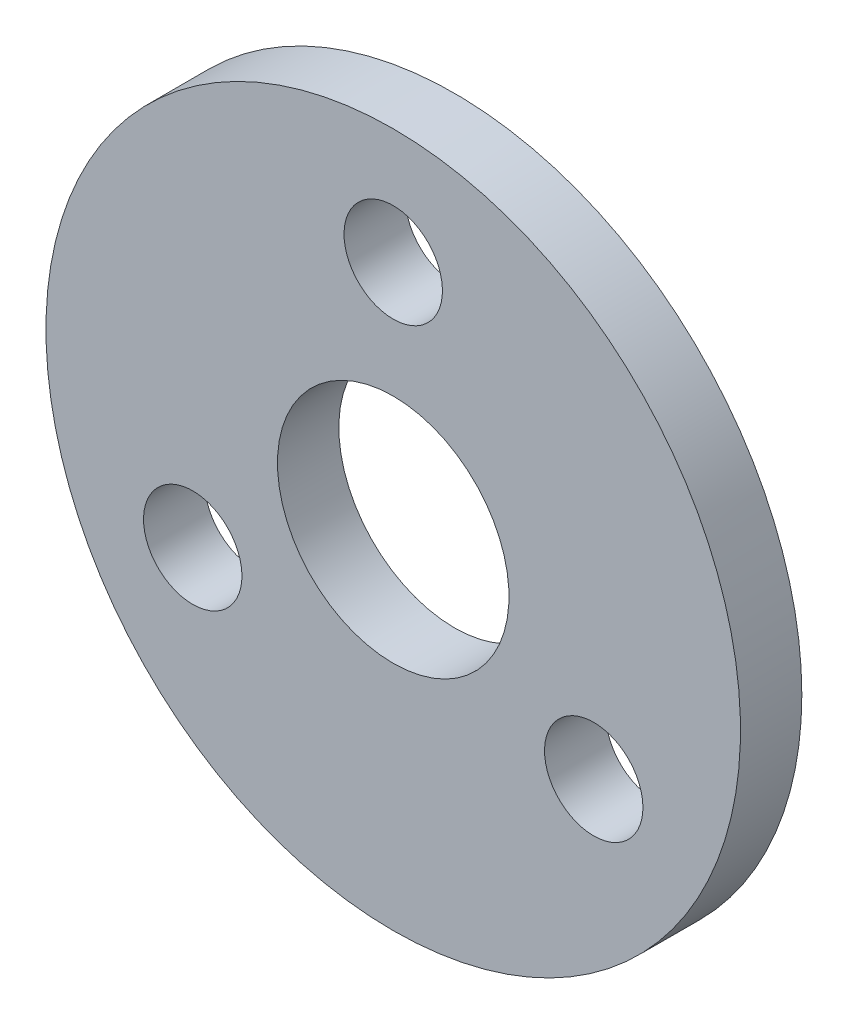
ISO-10303-21;
HEADER;
FILE_DESCRIPTION(('STEP AP214'),'2;1');
FILE_NAME('part.step','',(''),(''),'','','');
FILE_SCHEMA(('AUTOMOTIVE_DESIGN { 1 0 10303 214 1 1 1 1 }'));
ENDSEC;
DATA;
#1=APPLICATION_CONTEXT('core data for automotive mechanical design processes');
#2=APPLICATION_PROTOCOL_DEFINITION('international standard','automotive_design',2000,#1);
#3=PRODUCT_CONTEXT('',#1,'mechanical');
#4=PRODUCT('Part','Part','',(#3));
#5=PRODUCT_RELATED_PRODUCT_CATEGORY('part','',(#4));
#6=PRODUCT_DEFINITION_FORMATION('','',#4);
#7=PRODUCT_DEFINITION_CONTEXT('part definition',#1,'design');
#8=PRODUCT_DEFINITION('design','',#6,#7);
#9=PRODUCT_DEFINITION_SHAPE('','',#8);
#10=(LENGTH_UNIT() NAMED_UNIT(*) SI_UNIT(.MILLI.,.METRE.));
#11=(NAMED_UNIT(*) PLANE_ANGLE_UNIT() SI_UNIT($,.RADIAN.));
#12=(NAMED_UNIT(*) SI_UNIT($,.STERADIAN.) SOLID_ANGLE_UNIT());
#13=UNCERTAINTY_MEASURE_WITH_UNIT(LENGTH_MEASURE(1.E-05),#10,'distance_accuracy_value','');
#14=(GEOMETRIC_REPRESENTATION_CONTEXT(3) GLOBAL_UNCERTAINTY_ASSIGNED_CONTEXT((#13)) GLOBAL_UNIT_ASSIGNED_CONTEXT((#10,
#11,#12)) REPRESENTATION_CONTEXT('',''));
#15=CARTESIAN_POINT('',(0.,0.,0.));
#16=DIRECTION('',(0.,0.,1.));
#17=DIRECTION('',(1.,0.,0.));
#18=AXIS2_PLACEMENT_3D('',#15,#16,#17);
#19=CARTESIAN_POINT('',(0.,0.,45.5861254969543));
#20=DIRECTION('',(0.,0.,-1.));
#21=DIRECTION('',(-1.,0.,0.));
#22=AXIS2_PLACEMENT_3D('',#19,#20,#21);
#23=CYLINDRICAL_SURFACE('',#22,4.);
#24=CARTESIAN_POINT('',(0.,0.,9.525));
#25=DIRECTION('',(0.,0.,1.));
#26=DIRECTION('',(1.,0.,0.));
#27=AXIS2_PLACEMENT_3D('',#24,#25,#26);
#28=CIRCLE('',#27,4.);
#29=CARTESIAN_POINT('',(4.,0.,9.525));
#30=VERTEX_POINT('',#29);
#31=EDGE_CURVE('E52',#30,#30,#28,.T.);
#32=ORIENTED_EDGE('',*,*,#31,.F.);
#33=EDGE_LOOP('',(#32));
#34=FACE_BOUND('',#33,.T.);
#35=CARTESIAN_POINT('',(0.,0.,11.645));
#36=DIRECTION('',(0.,0.,1.));
#37=DIRECTION('',(0.,-1.,0.));
#38=AXIS2_PLACEMENT_3D('',#35,#36,#37);
#39=CIRCLE('',#38,4.);
#40=CARTESIAN_POINT('',(0.,-4.,11.645));
#41=VERTEX_POINT('',#40);
#42=EDGE_CURVE('E74',#41,#41,#39,.T.);
#43=ORIENTED_EDGE('',*,*,#42,.T.);
#44=EDGE_LOOP('',(#43));
#45=FACE_BOUND('',#44,.T.);
#46=ADVANCED_FACE('F31',(#34,#45),#23,.F.);
#47=CARTESIAN_POINT('',(6.92820323027549,-4.00000000000003,45.5861254969543));
#48=DIRECTION('',(0.,0.,-1.));
#49=DIRECTION('',(-1.,0.,0.));
#50=AXIS2_PLACEMENT_3D('',#47,#48,#49);
#51=CYLINDRICAL_SURFACE('',#50,1.7);
#52=CARTESIAN_POINT('',(6.92820323027549,-4.00000000000003,9.525));
#53=DIRECTION('',(0.,0.,1.));
#54=DIRECTION('',(1.,0.,0.));
#55=AXIS2_PLACEMENT_3D('',#52,#53,#54);
#56=CIRCLE('',#55,1.7);
#57=CARTESIAN_POINT('',(8.62820323027549,-4.00000000000003,9.525));
#58=VERTEX_POINT('',#57);
#59=EDGE_CURVE('E55',#58,#58,#56,.T.);
#60=ORIENTED_EDGE('',*,*,#59,.F.);
#61=EDGE_LOOP('',(#60));
#62=FACE_BOUND('',#61,.T.);
#63=CARTESIAN_POINT('',(6.92820323027549,-4.00000000000003,11.645));
#64=DIRECTION('',(0.,0.,1.));
#65=DIRECTION('',(0.,-1.,0.));
#66=AXIS2_PLACEMENT_3D('',#63,#64,#65);
#67=CIRCLE('',#66,1.7);
#68=CARTESIAN_POINT('',(6.92820323027549,-5.70000000000003,11.645));
#69=VERTEX_POINT('',#68);
#70=EDGE_CURVE('E72',#69,#69,#67,.T.);
#71=ORIENTED_EDGE('',*,*,#70,.T.);
#72=EDGE_LOOP('',(#71));
#73=FACE_BOUND('',#72,.T.);
#74=ADVANCED_FACE('F67',(#62,#73),#51,.F.);
#75=CARTESIAN_POINT('',(-6.92820323027555,-3.99999999999994,45.5861254969543));
#76=DIRECTION('',(0.,0.,-1.));
#77=DIRECTION('',(-1.,0.,0.));
#78=AXIS2_PLACEMENT_3D('',#75,#76,#77);
#79=CYLINDRICAL_SURFACE('',#78,1.7);
#80=CARTESIAN_POINT('',(-6.92820323027555,-3.99999999999994,9.525));
#81=DIRECTION('',(0.,0.,1.));
#82=DIRECTION('',(1.,0.,0.));
#83=AXIS2_PLACEMENT_3D('',#80,#81,#82);
#84=CIRCLE('',#83,1.7);
#85=CARTESIAN_POINT('',(-5.22820323027555,-3.99999999999994,9.525));
#86=VERTEX_POINT('',#85);
#87=EDGE_CURVE('E44',#86,#86,#84,.T.);
#88=ORIENTED_EDGE('',*,*,#87,.F.);
#89=EDGE_LOOP('',(#88));
#90=FACE_BOUND('',#89,.T.);
#91=CARTESIAN_POINT('',(-6.92820323027555,-3.99999999999994,11.645));
#92=DIRECTION('',(0.,0.,1.));
#93=DIRECTION('',(0.,-1.,0.));
#94=AXIS2_PLACEMENT_3D('',#91,#92,#93);
#95=CIRCLE('',#94,1.7);
#96=CARTESIAN_POINT('',(-6.92820323027555,-5.69999999999994,11.645));
#97=VERTEX_POINT('',#96);
#98=EDGE_CURVE('E47',#97,#97,#95,.T.);
#99=ORIENTED_EDGE('',*,*,#98,.T.);
#100=EDGE_LOOP('',(#99));
#101=FACE_BOUND('',#100,.T.);
#102=ADVANCED_FACE('F64',(#90,#101),#79,.F.);
#103=CARTESIAN_POINT('',(0.,0.,45.5861254969543));
#104=DIRECTION('',(0.,0.,-1.));
#105=DIRECTION('',(-1.,0.,0.));
#106=AXIS2_PLACEMENT_3D('',#103,#104,#105);
#107=CYLINDRICAL_SURFACE('',#106,12.);
#108=CARTESIAN_POINT('',(0.,0.,9.525));
#109=DIRECTION('',(0.,0.,1.));
#110=DIRECTION('',(1.,0.,0.));
#111=AXIS2_PLACEMENT_3D('',#108,#109,#110);
#112=CIRCLE('',#111,12.);
#113=CARTESIAN_POINT('',(12.,0.,9.525));
#114=VERTEX_POINT('',#113);
#115=EDGE_CURVE('E39',#114,#114,#112,.T.);
#116=ORIENTED_EDGE('',*,*,#115,.T.);
#117=EDGE_LOOP('',(#116));
#118=FACE_BOUND('',#117,.T.);
#119=CARTESIAN_POINT('',(0.,0.,11.645));
#120=DIRECTION('',(0.,0.,1.));
#121=DIRECTION('',(0.,-1.,0.));
#122=AXIS2_PLACEMENT_3D('',#119,#120,#121);
#123=CIRCLE('',#122,12.);
#124=CARTESIAN_POINT('',(0.,-12.,11.645));
#125=VERTEX_POINT('',#124);
#126=EDGE_CURVE('E10',#125,#125,#123,.T.);
#127=ORIENTED_EDGE('',*,*,#126,.F.);
#128=EDGE_LOOP('',(#127));
#129=FACE_BOUND('',#128,.T.);
#130=ADVANCED_FACE('F33',(#118,#129),#107,.T.);
#131=CARTESIAN_POINT('',(0.,0.,9.525));
#132=DIRECTION('',(0.,0.,1.));
#133=DIRECTION('',(1.,0.,0.));
#134=AXIS2_PLACEMENT_3D('',#131,#132,#133);
#135=PLANE('',#134);
#136=ORIENTED_EDGE('',*,*,#115,.F.);
#137=EDGE_LOOP('',(#136));
#138=FACE_BOUND('',#137,.T.);
#139=ORIENTED_EDGE('',*,*,#87,.T.);
#140=EDGE_LOOP('',(#139));
#141=FACE_BOUND('',#140,.T.);
#142=ORIENTED_EDGE('',*,*,#59,.T.);
#143=EDGE_LOOP('',(#142));
#144=FACE_BOUND('',#143,.T.);
#145=ORIENTED_EDGE('',*,*,#31,.T.);
#146=EDGE_LOOP('',(#145));
#147=FACE_BOUND('',#146,.T.);
#148=CARTESIAN_POINT('',(0.,8.,9.525));
#149=DIRECTION('',(0.,0.,1.));
#150=DIRECTION('',(1.,0.,0.));
#151=AXIS2_PLACEMENT_3D('',#148,#149,#150);
#152=CIRCLE('',#151,1.7);
#153=CARTESIAN_POINT('',(1.7,8.,9.525));
#154=VERTEX_POINT('',#153);
#155=EDGE_CURVE('E49',#154,#154,#152,.T.);
#156=ORIENTED_EDGE('',*,*,#155,.T.);
#157=EDGE_LOOP('',(#156));
#158=FACE_BOUND('',#157,.T.);
#159=ADVANCED_FACE('F61',(#138,#141,#144,#147,#158),#135,.F.);
#160=CARTESIAN_POINT('',(0.,8.,45.5861254969543));
#161=DIRECTION('',(0.,0.,-1.));
#162=DIRECTION('',(-1.,0.,0.));
#163=AXIS2_PLACEMENT_3D('',#160,#161,#162);
#164=CYLINDRICAL_SURFACE('',#163,1.7);
#165=ORIENTED_EDGE('',*,*,#155,.F.);
#166=EDGE_LOOP('',(#165));
#167=FACE_BOUND('',#166,.T.);
#168=CARTESIAN_POINT('',(0.,8.,11.645));
#169=DIRECTION('',(0.,0.,1.));
#170=DIRECTION('',(0.,-1.,0.));
#171=AXIS2_PLACEMENT_3D('',#168,#169,#170);
#172=CIRCLE('',#171,1.7);
#173=CARTESIAN_POINT('',(0.,6.3,11.645));
#174=VERTEX_POINT('',#173);
#175=EDGE_CURVE('E35',#174,#174,#172,.T.);
#176=ORIENTED_EDGE('',*,*,#175,.T.);
#177=EDGE_LOOP('',(#176));
#178=FACE_BOUND('',#177,.T.);
#179=ADVANCED_FACE('F84',(#167,#178),#164,.F.);
#180=CARTESIAN_POINT('',(0.,-4.,11.645));
#181=DIRECTION('',(0.,0.,1.));
#182=DIRECTION('',(0.,1.,0.));
#183=AXIS2_PLACEMENT_3D('',#180,#181,#182);
#184=PLANE('',#183);
#185=ORIENTED_EDGE('',*,*,#175,.F.);
#186=EDGE_LOOP('',(#185));
#187=FACE_BOUND('',#186,.T.);
#188=ORIENTED_EDGE('',*,*,#42,.F.);
#189=EDGE_LOOP('',(#188));
#190=FACE_BOUND('',#189,.T.);
#191=ORIENTED_EDGE('',*,*,#70,.F.);
#192=EDGE_LOOP('',(#191));
#193=FACE_BOUND('',#192,.T.);
#194=ORIENTED_EDGE('',*,*,#98,.F.);
#195=EDGE_LOOP('',(#194));
#196=FACE_BOUND('',#195,.T.);
#197=ORIENTED_EDGE('',*,*,#126,.T.);
#198=EDGE_LOOP('',(#197));
#199=FACE_BOUND('',#198,.T.);
#200=ADVANCED_FACE('F86',(#187,#190,#193,#196,#199),#184,.T.);
#201=CLOSED_SHELL('',(#46,#74,#102,#130,#159,#179,#200));
#202=MANIFOLD_SOLID_BREP('B2',#201);
#203=ADVANCED_BREP_SHAPE_REPRESENTATION('',(#18,#202),#14);
#204=SHAPE_DEFINITION_REPRESENTATION(#9,#203);
ENDSEC;
END-ISO-10303-21;
